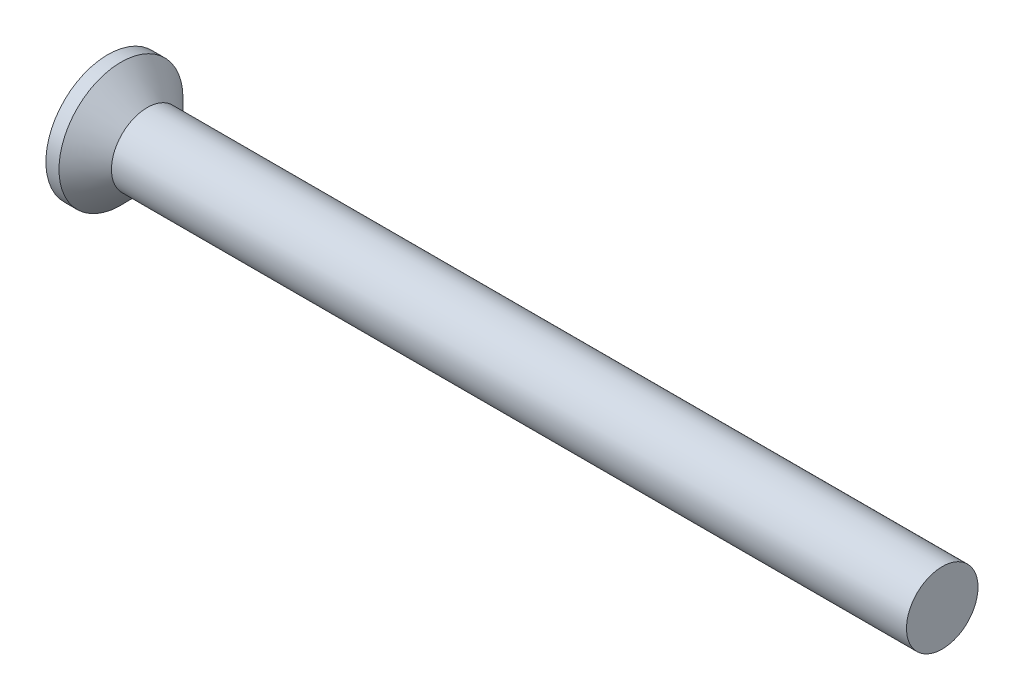
ISO-10303-21;
HEADER;
FILE_DESCRIPTION(('STEP AP214'),'2;1');
FILE_NAME('part.step','',(''),(''),'','','');
FILE_SCHEMA(('AUTOMOTIVE_DESIGN { 1 0 10303 214 1 1 1 1 }'));
ENDSEC;
DATA;
#1=APPLICATION_CONTEXT('core data for automotive mechanical design processes');
#2=APPLICATION_PROTOCOL_DEFINITION('international standard','automotive_design',2000,#1);
#3=PRODUCT_CONTEXT('',#1,'mechanical');
#4=PRODUCT('Part','Part','',(#3));
#5=PRODUCT_RELATED_PRODUCT_CATEGORY('part','',(#4));
#6=PRODUCT_DEFINITION_FORMATION('','',#4);
#7=PRODUCT_DEFINITION_CONTEXT('part definition',#1,'design');
#8=PRODUCT_DEFINITION('design','',#6,#7);
#9=PRODUCT_DEFINITION_SHAPE('','',#8);
#10=(LENGTH_UNIT() NAMED_UNIT(*) SI_UNIT(.MILLI.,.METRE.));
#11=(NAMED_UNIT(*) PLANE_ANGLE_UNIT() SI_UNIT($,.RADIAN.));
#12=(NAMED_UNIT(*) SI_UNIT($,.STERADIAN.) SOLID_ANGLE_UNIT());
#13=UNCERTAINTY_MEASURE_WITH_UNIT(LENGTH_MEASURE(1.E-05),#10,'distance_accuracy_value','');
#14=(GEOMETRIC_REPRESENTATION_CONTEXT(3) GLOBAL_UNCERTAINTY_ASSIGNED_CONTEXT((#13)) GLOBAL_UNIT_ASSIGNED_CONTEXT((#10,
#11,#12)) REPRESENTATION_CONTEXT('',''));
#15=CARTESIAN_POINT('',(0.,0.,0.));
#16=DIRECTION('',(0.,0.,1.));
#17=DIRECTION('',(1.,0.,0.));
#18=AXIS2_PLACEMENT_3D('',#15,#16,#17);
#19=CARTESIAN_POINT('',(0.,2.6,0.));
#20=DIRECTION('',(-1.,0.,0.));
#21=DIRECTION('',(0.,0.,1.));
#22=AXIS2_PLACEMENT_3D('',#19,#20,#21);
#23=PLANE('',#22);
#24=CARTESIAN_POINT('',(0.,0.,0.));
#25=DIRECTION('',(1.,0.,0.));
#26=DIRECTION('',(0.,0.,-1.));
#27=AXIS2_PLACEMENT_3D('',#24,#25,#26);
#28=CIRCLE('',#27,2.6);
#29=CARTESIAN_POINT('',(0.,0.,-2.6));
#30=VERTEX_POINT('',#29);
#31=EDGE_CURVE('E190',#30,#30,#28,.T.);
#32=ORIENTED_EDGE('',*,*,#31,.F.);
#33=EDGE_LOOP('',(#32));
#34=FACE_BOUND('',#33,.T.);
#35=DIRECTION('',(0.,1.,0.));
#36=VECTOR('',#35,1.);
#37=CARTESIAN_POINT('',(0.,-0.32,-0.32));
#38=LINE('',#37,#36);
#39=CARTESIAN_POINT('',(0.,-1.6,-0.32));
#40=VERTEX_POINT('',#39);
#41=CARTESIAN_POINT('',(0.,-0.62,-0.32));
#42=VERTEX_POINT('',#41);
#43=EDGE_CURVE('E316',#40,#42,#38,.T.);
#44=ORIENTED_EDGE('',*,*,#43,.T.);
#45=CARTESIAN_POINT('',(0.,-0.62,-0.62));
#46=DIRECTION('',(-1.,0.,0.));
#47=DIRECTION('',(0.,0.,1.));
#48=AXIS2_PLACEMENT_3D('',#45,#46,#47);
#49=CIRCLE('',#48,0.3);
#50=CARTESIAN_POINT('',(0.,-0.32,-0.62));
#51=VERTEX_POINT('',#50);
#52=EDGE_CURVE('E195',#42,#51,#49,.T.);
#53=ORIENTED_EDGE('',*,*,#52,.T.);
#54=DIRECTION('',(0.,0.,-1.));
#55=VECTOR('',#54,1.);
#56=CARTESIAN_POINT('',(0.,-0.32,-0.32));
#57=LINE('',#56,#55);
#58=CARTESIAN_POINT('',(0.,-0.32,-1.6));
#59=VERTEX_POINT('',#58);
#60=EDGE_CURVE('E318',#51,#59,#57,.T.);
#61=ORIENTED_EDGE('',*,*,#60,.T.);
#62=DIRECTION('',(0.,1.,0.));
#63=VECTOR('',#62,1.);
#64=CARTESIAN_POINT('',(0.,0.32,-1.6));
#65=LINE('',#64,#63);
#66=CARTESIAN_POINT('',(0.,0.32,-1.6));
#67=VERTEX_POINT('',#66);
#68=EDGE_CURVE('E320',#59,#67,#65,.T.);
#69=ORIENTED_EDGE('',*,*,#68,.T.);
#70=DIRECTION('',(0.,0.,1.));
#71=VECTOR('',#70,1.);
#72=CARTESIAN_POINT('',(0.,0.32,-0.32));
#73=LINE('',#72,#71);
#74=CARTESIAN_POINT('',(0.,0.32,-0.62));
#75=VERTEX_POINT('',#74);
#76=EDGE_CURVE('E323',#67,#75,#73,.T.);
#77=ORIENTED_EDGE('',*,*,#76,.T.);
#78=CARTESIAN_POINT('',(0.,0.62,-0.62));
#79=DIRECTION('',(-1.,0.,0.));
#80=DIRECTION('',(0.,0.,1.));
#81=AXIS2_PLACEMENT_3D('',#78,#79,#80);
#82=CIRCLE('',#81,0.3);
#83=CARTESIAN_POINT('',(0.,0.62,-0.32));
#84=VERTEX_POINT('',#83);
#85=EDGE_CURVE('E193',#75,#84,#82,.T.);
#86=ORIENTED_EDGE('',*,*,#85,.T.);
#87=DIRECTION('',(0.,1.,0.));
#88=VECTOR('',#87,1.);
#89=CARTESIAN_POINT('',(0.,0.32,-0.32));
#90=LINE('',#89,#88);
#91=CARTESIAN_POINT('',(0.,1.6,-0.32));
#92=VERTEX_POINT('',#91);
#93=EDGE_CURVE('E326',#84,#92,#90,.T.);
#94=ORIENTED_EDGE('',*,*,#93,.T.);
#95=DIRECTION('',(0.,0.,1.));
#96=VECTOR('',#95,1.);
#97=CARTESIAN_POINT('',(0.,1.6,-0.32));
#98=LINE('',#97,#96);
#99=CARTESIAN_POINT('',(0.,1.6,0.32));
#100=VERTEX_POINT('',#99);
#101=EDGE_CURVE('E328',#92,#100,#98,.T.);
#102=ORIENTED_EDGE('',*,*,#101,.T.);
#103=DIRECTION('',(0.,-1.,0.));
#104=VECTOR('',#103,1.);
#105=CARTESIAN_POINT('',(0.,0.32,0.32));
#106=LINE('',#105,#104);
#107=CARTESIAN_POINT('',(0.,0.62,0.32));
#108=VERTEX_POINT('',#107);
#109=EDGE_CURVE('E331',#100,#108,#106,.T.);
#110=ORIENTED_EDGE('',*,*,#109,.T.);
#111=CARTESIAN_POINT('',(0.,0.62,0.62));
#112=DIRECTION('',(-1.,0.,0.));
#113=DIRECTION('',(0.,0.,1.));
#114=AXIS2_PLACEMENT_3D('',#111,#112,#113);
#115=CIRCLE('',#114,0.3);
#116=CARTESIAN_POINT('',(0.,0.32,0.62));
#117=VERTEX_POINT('',#116);
#118=EDGE_CURVE('E158',#108,#117,#115,.T.);
#119=ORIENTED_EDGE('',*,*,#118,.T.);
#120=DIRECTION('',(0.,0.,1.));
#121=VECTOR('',#120,1.);
#122=CARTESIAN_POINT('',(0.,0.32,0.32));
#123=LINE('',#122,#121);
#124=CARTESIAN_POINT('',(0.,0.32,1.6));
#125=VERTEX_POINT('',#124);
#126=EDGE_CURVE('E152',#117,#125,#123,.T.);
#127=ORIENTED_EDGE('',*,*,#126,.T.);
#128=DIRECTION('',(0.,-1.,0.));
#129=VECTOR('',#128,1.);
#130=CARTESIAN_POINT('',(0.,0.32,1.6));
#131=LINE('',#130,#129);
#132=CARTESIAN_POINT('',(0.,-0.32,1.6));
#133=VERTEX_POINT('',#132);
#134=EDGE_CURVE('E156',#125,#133,#131,.T.);
#135=ORIENTED_EDGE('',*,*,#134,.T.);
#136=DIRECTION('',(0.,0.,-1.));
#137=VECTOR('',#136,1.);
#138=CARTESIAN_POINT('',(0.,-0.32,0.32));
#139=LINE('',#138,#137);
#140=CARTESIAN_POINT('',(0.,-0.32,0.62));
#141=VERTEX_POINT('',#140);
#142=EDGE_CURVE('E170',#133,#141,#139,.T.);
#143=ORIENTED_EDGE('',*,*,#142,.T.);
#144=CARTESIAN_POINT('',(0.,-0.62,0.62));
#145=DIRECTION('',(-1.,0.,0.));
#146=DIRECTION('',(0.,0.,1.));
#147=AXIS2_PLACEMENT_3D('',#144,#145,#146);
#148=CIRCLE('',#147,0.3);
#149=CARTESIAN_POINT('',(0.,-0.62,0.32));
#150=VERTEX_POINT('',#149);
#151=EDGE_CURVE('E189',#141,#150,#148,.T.);
#152=ORIENTED_EDGE('',*,*,#151,.T.);
#153=DIRECTION('',(0.,-1.,0.));
#154=VECTOR('',#153,1.);
#155=CARTESIAN_POINT('',(0.,-0.32,0.32));
#156=LINE('',#155,#154);
#157=CARTESIAN_POINT('',(0.,-1.6,0.319999999999999));
#158=VERTEX_POINT('',#157);
#159=EDGE_CURVE('E311',#150,#158,#156,.T.);
#160=ORIENTED_EDGE('',*,*,#159,.T.);
#161=DIRECTION('',(0.,0.,-1.));
#162=VECTOR('',#161,1.);
#163=CARTESIAN_POINT('',(0.,-1.6,-0.32));
#164=LINE('',#163,#162);
#165=EDGE_CURVE('E313',#158,#40,#164,.T.);
#166=ORIENTED_EDGE('',*,*,#165,.T.);
#167=EDGE_LOOP('',(#44,#53,#61,#69,#77,#86,#94,#102,#110,#119,#127,#135,#143,#152,#160,#166));
#168=FACE_BOUND('',#167,.T.);
#169=ADVANCED_FACE('F39',(#34,#168),#23,.T.);
#170=CARTESIAN_POINT('',(35.,1.5,0.));
#171=DIRECTION('',(1.,0.,0.));
#172=DIRECTION('',(0.,0.,-1.));
#173=AXIS2_PLACEMENT_3D('',#170,#171,#172);
#174=PLANE('',#173);
#175=CARTESIAN_POINT('',(35.,0.,0.));
#176=DIRECTION('',(1.,0.,0.));
#177=DIRECTION('',(0.,0.,-1.));
#178=AXIS2_PLACEMENT_3D('',#175,#176,#177);
#179=CIRCLE('',#178,1.5);
#180=CARTESIAN_POINT('',(35.,0.,-1.5));
#181=VERTEX_POINT('',#180);
#182=EDGE_CURVE('E176',#181,#181,#179,.T.);
#183=ORIENTED_EDGE('',*,*,#182,.T.);
#184=EDGE_LOOP('',(#183));
#185=FACE_BOUND('',#184,.T.);
#186=ADVANCED_FACE('F243',(#185),#174,.T.);
#187=CARTESIAN_POINT('',(4.51581291088132,0.,0.));
#188=DIRECTION('',(1.,0.,0.));
#189=DIRECTION('',(0.,0.,-1.));
#190=AXIS2_PLACEMENT_3D('',#187,#188,#189);
#191=CYLINDRICAL_SURFACE('',#190,2.6);
#192=ORIENTED_EDGE('',*,*,#31,.T.);
#193=EDGE_LOOP('',(#192));
#194=FACE_BOUND('',#193,.T.);
#195=CARTESIAN_POINT('',(0.550000000000004,0.,0.));
#196=DIRECTION('',(1.,0.,0.));
#197=DIRECTION('',(0.,0.,-1.));
#198=AXIS2_PLACEMENT_3D('',#195,#196,#197);
#199=CIRCLE('',#198,2.6);
#200=CARTESIAN_POINT('',(0.550000000000004,0.,-2.6));
#201=VERTEX_POINT('',#200);
#202=EDGE_CURVE('E335',#201,#201,#199,.T.);
#203=ORIENTED_EDGE('',*,*,#202,.F.);
#204=EDGE_LOOP('',(#203));
#205=FACE_BOUND('',#204,.T.);
#206=ADVANCED_FACE('F249',(#194,#205),#191,.T.);
#207=CARTESIAN_POINT('',(1.65,0.,0.));
#208=DIRECTION('',(-1.,0.,0.));
#209=DIRECTION('',(0.,0.,1.));
#210=AXIS2_PLACEMENT_3D('',#207,#208,#209);
#211=CONICAL_SURFACE('',#210,1.5,0.78539816339745);
#212=ORIENTED_EDGE('',*,*,#202,.T.);
#213=EDGE_LOOP('',(#212));
#214=FACE_BOUND('',#213,.T.);
#215=CARTESIAN_POINT('',(1.65,0.,0.));
#216=DIRECTION('',(1.,0.,0.));
#217=DIRECTION('',(0.,0.,-1.));
#218=AXIS2_PLACEMENT_3D('',#215,#216,#217);
#219=CIRCLE('',#218,1.5);
#220=CARTESIAN_POINT('',(1.65,0.,-1.5));
#221=VERTEX_POINT('',#220);
#222=EDGE_CURVE('E179',#221,#221,#219,.T.);
#223=ORIENTED_EDGE('',*,*,#222,.F.);
#224=EDGE_LOOP('',(#223));
#225=FACE_BOUND('',#224,.T.);
#226=ADVANCED_FACE('F371',(#214,#225),#211,.T.);
#227=CARTESIAN_POINT('',(4.51581291088132,0.,0.));
#228=DIRECTION('',(1.,0.,0.));
#229=DIRECTION('',(0.,0.,-1.));
#230=AXIS2_PLACEMENT_3D('',#227,#228,#229);
#231=CYLINDRICAL_SURFACE('',#230,1.5);
#232=ORIENTED_EDGE('',*,*,#222,.T.);
#233=EDGE_LOOP('',(#232));
#234=FACE_BOUND('',#233,.T.);
#235=ORIENTED_EDGE('',*,*,#182,.F.);
#236=EDGE_LOOP('',(#235));
#237=FACE_BOUND('',#236,.T.);
#238=ADVANCED_FACE('F369',(#234,#237),#231,.T.);
#239=CARTESIAN_POINT('',(0.825,0.32,0.32));
#240=DIRECTION('',(0.,-1.,0.));
#241=DIRECTION('',(0.,0.,-1.));
#242=AXIS2_PLACEMENT_3D('',#239,#240,#241);
#243=PLANE('',#242);
#244=ORIENTED_EDGE('',*,*,#126,.F.);
#245=DIRECTION('',(-1.,0.,0.));
#246=VECTOR('',#245,1.);
#247=CARTESIAN_POINT('',(0.825,0.32,0.62));
#248=LINE('',#247,#246);
#249=CARTESIAN_POINT('',(0.825,0.32,0.62));
#250=VERTEX_POINT('',#249);
#251=EDGE_CURVE('E207',#117,#250,#248,.F.);
#252=ORIENTED_EDGE('',*,*,#251,.T.);
#253=DIRECTION('',(0.,0.,1.));
#254=VECTOR('',#253,1.);
#255=CARTESIAN_POINT('',(0.825,0.32,0.32));
#256=LINE('',#255,#254);
#257=CARTESIAN_POINT('',(0.825,0.32,1.12368602791856));
#258=VERTEX_POINT('',#257);
#259=EDGE_CURVE('E174',#250,#258,#256,.T.);
#260=ORIENTED_EDGE('',*,*,#259,.T.);
#261=DIRECTION('',(-0.866025403784438,0.,0.500000000000001));
#262=VECTOR('',#261,1.);
#263=CARTESIAN_POINT('',(0.,0.32,1.6));
#264=LINE('',#263,#262);
#265=EDGE_CURVE('E166',#258,#125,#264,.T.);
#266=ORIENTED_EDGE('',*,*,#265,.T.);
#267=EDGE_LOOP('',(#244,#252,#260,#266));
#268=FACE_BOUND('',#267,.T.);
#269=ADVANCED_FACE('F172',(#268),#243,.T.);
#270=CARTESIAN_POINT('',(0.,0.32,1.6));
#271=DIRECTION('',(-0.500000000000001,0.,-0.866025403784438));
#272=DIRECTION('',(-0.866025403784438,0.,0.500000000000001));
#273=AXIS2_PLACEMENT_3D('',#270,#271,#272);
#274=PLANE('',#273);
#275=ORIENTED_EDGE('',*,*,#134,.F.);
#276=ORIENTED_EDGE('',*,*,#265,.F.);
#277=DIRECTION('',(0.,-1.,0.));
#278=VECTOR('',#277,1.);
#279=CARTESIAN_POINT('',(0.825,0.32,1.12368602791856));
#280=LINE('',#279,#278);
#281=CARTESIAN_POINT('',(0.825,-0.32,1.12368602791856));
#282=VERTEX_POINT('',#281);
#283=EDGE_CURVE('E185',#258,#282,#280,.T.);
#284=ORIENTED_EDGE('',*,*,#283,.T.);
#285=DIRECTION('',(-0.866025403784438,0.,0.500000000000001));
#286=VECTOR('',#285,1.);
#287=CARTESIAN_POINT('',(1.17300625842204,-0.32,0.922764520938917));
#288=LINE('',#287,#286);
#289=EDGE_CURVE('E168',#282,#133,#288,.T.);
#290=ORIENTED_EDGE('',*,*,#289,.T.);
#291=EDGE_LOOP('',(#275,#276,#284,#290));
#292=FACE_BOUND('',#291,.T.);
#293=ADVANCED_FACE('F165',(#292),#274,.T.);
#294=CARTESIAN_POINT('',(0.825,-0.32,0.32));
#295=DIRECTION('',(0.,1.,0.));
#296=DIRECTION('',(0.,0.,1.));
#297=AXIS2_PLACEMENT_3D('',#294,#295,#296);
#298=PLANE('',#297);
#299=DIRECTION('',(0.,0.,-1.));
#300=VECTOR('',#299,1.);
#301=CARTESIAN_POINT('',(0.825,-0.32,0.32));
#302=LINE('',#301,#300);
#303=CARTESIAN_POINT('',(0.825,-0.32,0.62));
#304=VERTEX_POINT('',#303);
#305=EDGE_CURVE('E357',#282,#304,#302,.T.);
#306=ORIENTED_EDGE('',*,*,#305,.T.);
#307=DIRECTION('',(-1.,0.,0.));
#308=VECTOR('',#307,1.);
#309=CARTESIAN_POINT('',(0.825,-0.32,0.62));
#310=LINE('',#309,#308);
#311=EDGE_CURVE('E209',#304,#141,#310,.T.);
#312=ORIENTED_EDGE('',*,*,#311,.T.);
#313=ORIENTED_EDGE('',*,*,#142,.F.);
#314=ORIENTED_EDGE('',*,*,#289,.F.);
#315=EDGE_LOOP('',(#306,#312,#313,#314));
#316=FACE_BOUND('',#315,.T.);
#317=ADVANCED_FACE('F263',(#316),#298,.T.);
#318=CARTESIAN_POINT('',(0.825,-0.32,0.32));
#319=DIRECTION('',(0.,0.,-1.));
#320=DIRECTION('',(0.,1.,0.));
#321=AXIS2_PLACEMENT_3D('',#318,#319,#320);
#322=PLANE('',#321);
#323=ORIENTED_EDGE('',*,*,#159,.F.);
#324=DIRECTION('',(-1.,0.,0.));
#325=VECTOR('',#324,1.);
#326=CARTESIAN_POINT('',(0.825,-0.62,0.32));
#327=LINE('',#326,#325);
#328=CARTESIAN_POINT('',(0.825,-0.62,0.32));
#329=VERTEX_POINT('',#328);
#330=EDGE_CURVE('E54',#150,#329,#327,.F.);
#331=ORIENTED_EDGE('',*,*,#330,.T.);
#332=DIRECTION('',(0.,-1.,0.));
#333=VECTOR('',#332,1.);
#334=CARTESIAN_POINT('',(0.825,-0.32,0.32));
#335=LINE('',#334,#333);
#336=CARTESIAN_POINT('',(0.825,-1.12368602791856,0.319999999999999));
#337=VERTEX_POINT('',#336);
#338=EDGE_CURVE('E300',#329,#337,#335,.T.);
#339=ORIENTED_EDGE('',*,*,#338,.T.);
#340=DIRECTION('',(-0.866025403784438,-0.500000000000001,0.));
#341=VECTOR('',#340,1.);
#342=CARTESIAN_POINT('',(0.,-1.6,0.319999999999999));
#343=LINE('',#342,#341);
#344=EDGE_CURVE('E181',#337,#158,#343,.T.);
#345=ORIENTED_EDGE('',*,*,#344,.T.);
#346=EDGE_LOOP('',(#323,#331,#339,#345));
#347=FACE_BOUND('',#346,.T.);
#348=ADVANCED_FACE('F268',(#347),#322,.T.);
#349=CARTESIAN_POINT('',(0.,-1.6,-0.32));
#350=DIRECTION('',(-0.500000000000001,0.866025403784438,0.));
#351=DIRECTION('',(-0.866025403784438,-0.500000000000001,0.));
#352=AXIS2_PLACEMENT_3D('',#349,#350,#351);
#353=PLANE('',#352);
#354=ORIENTED_EDGE('',*,*,#165,.F.);
#355=ORIENTED_EDGE('',*,*,#344,.F.);
#356=DIRECTION('',(0.,0.,-1.));
#357=VECTOR('',#356,1.);
#358=CARTESIAN_POINT('',(0.825,-1.12368602791856,-0.32));
#359=LINE('',#358,#357);
#360=CARTESIAN_POINT('',(0.825,-1.12368602791856,-0.32));
#361=VERTEX_POINT('',#360);
#362=EDGE_CURVE('E296',#337,#361,#359,.T.);
#363=ORIENTED_EDGE('',*,*,#362,.T.);
#364=DIRECTION('',(-0.866025403784438,-0.500000000000001,0.));
#365=VECTOR('',#364,1.);
#366=CARTESIAN_POINT('',(1.17300625842204,-0.922764520938917,-0.32));
#367=LINE('',#366,#365);
#368=EDGE_CURVE('E295',#361,#40,#367,.T.);
#369=ORIENTED_EDGE('',*,*,#368,.T.);
#370=EDGE_LOOP('',(#354,#355,#363,#369));
#371=FACE_BOUND('',#370,.T.);
#372=ADVANCED_FACE('F264',(#371),#353,.T.);
#373=CARTESIAN_POINT('',(0.825,-0.32,-0.32));
#374=DIRECTION('',(0.,0.,1.));
#375=DIRECTION('',(1.,0.,0.));
#376=AXIS2_PLACEMENT_3D('',#373,#374,#375);
#377=PLANE('',#376);
#378=DIRECTION('',(0.,1.,0.));
#379=VECTOR('',#378,1.);
#380=CARTESIAN_POINT('',(0.825,-0.32,-0.32));
#381=LINE('',#380,#379);
#382=CARTESIAN_POINT('',(0.825,-0.62,-0.32));
#383=VERTEX_POINT('',#382);
#384=EDGE_CURVE('E289',#361,#383,#381,.T.);
#385=ORIENTED_EDGE('',*,*,#384,.T.);
#386=DIRECTION('',(-1.,0.,0.));
#387=VECTOR('',#386,1.);
#388=CARTESIAN_POINT('',(0.825,-0.62,-0.32));
#389=LINE('',#388,#387);
#390=EDGE_CURVE('E186',#383,#42,#389,.T.);
#391=ORIENTED_EDGE('',*,*,#390,.T.);
#392=ORIENTED_EDGE('',*,*,#43,.F.);
#393=ORIENTED_EDGE('',*,*,#368,.F.);
#394=EDGE_LOOP('',(#385,#391,#392,#393));
#395=FACE_BOUND('',#394,.T.);
#396=ADVANCED_FACE('F267',(#395),#377,.T.);
#397=CARTESIAN_POINT('',(0.825,-0.32,-0.32));
#398=DIRECTION('',(0.,1.,0.));
#399=DIRECTION('',(0.,0.,1.));
#400=AXIS2_PLACEMENT_3D('',#397,#398,#399);
#401=PLANE('',#400);
#402=ORIENTED_EDGE('',*,*,#60,.F.);
#403=DIRECTION('',(-1.,0.,0.));
#404=VECTOR('',#403,1.);
#405=CARTESIAN_POINT('',(0.825,-0.32,-0.62));
#406=LINE('',#405,#404);
#407=CARTESIAN_POINT('',(0.825,-0.32,-0.62));
#408=VERTEX_POINT('',#407);
#409=EDGE_CURVE('E197',#51,#408,#406,.F.);
#410=ORIENTED_EDGE('',*,*,#409,.T.);
#411=DIRECTION('',(0.,0.,-1.));
#412=VECTOR('',#411,1.);
#413=CARTESIAN_POINT('',(0.825,-0.32,-0.32));
#414=LINE('',#413,#412);
#415=CARTESIAN_POINT('',(0.825,-0.32,-1.12368602791856));
#416=VERTEX_POINT('',#415);
#417=EDGE_CURVE('E291',#408,#416,#414,.T.);
#418=ORIENTED_EDGE('',*,*,#417,.T.);
#419=DIRECTION('',(-0.866025403784438,0.,-0.500000000000001));
#420=VECTOR('',#419,1.);
#421=CARTESIAN_POINT('',(0.,-0.32,-1.6));
#422=LINE('',#421,#420);
#423=EDGE_CURVE('E347',#416,#59,#422,.T.);
#424=ORIENTED_EDGE('',*,*,#423,.T.);
#425=EDGE_LOOP('',(#402,#410,#418,#424));
#426=FACE_BOUND('',#425,.T.);
#427=ADVANCED_FACE('F274',(#426),#401,.T.);
#428=CARTESIAN_POINT('',(0.,0.32,-1.6));
#429=DIRECTION('',(-0.500000000000001,0.,0.866025403784438));
#430=DIRECTION('',(0.866025403784438,0.,0.500000000000001));
#431=AXIS2_PLACEMENT_3D('',#428,#429,#430);
#432=PLANE('',#431);
#433=ORIENTED_EDGE('',*,*,#68,.F.);
#434=ORIENTED_EDGE('',*,*,#423,.F.);
#435=DIRECTION('',(0.,1.,0.));
#436=VECTOR('',#435,1.);
#437=CARTESIAN_POINT('',(0.825,0.32,-1.12368602791856));
#438=LINE('',#437,#436);
#439=CARTESIAN_POINT('',(0.825,0.32,-1.12368602791856));
#440=VERTEX_POINT('',#439);
#441=EDGE_CURVE('E298',#416,#440,#438,.T.);
#442=ORIENTED_EDGE('',*,*,#441,.T.);
#443=DIRECTION('',(-0.866025403784438,0.,-0.500000000000001));
#444=VECTOR('',#443,1.);
#445=CARTESIAN_POINT('',(1.17300625842204,0.32,-0.922764520938917));
#446=LINE('',#445,#444);
#447=EDGE_CURVE('E345',#440,#67,#446,.T.);
#448=ORIENTED_EDGE('',*,*,#447,.T.);
#449=EDGE_LOOP('',(#433,#434,#442,#448));
#450=FACE_BOUND('',#449,.T.);
#451=ADVANCED_FACE('F270',(#450),#432,.T.);
#452=CARTESIAN_POINT('',(0.825,0.32,-0.32));
#453=DIRECTION('',(0.,-1.,0.));
#454=DIRECTION('',(0.,0.,-1.));
#455=AXIS2_PLACEMENT_3D('',#452,#453,#454);
#456=PLANE('',#455);
#457=DIRECTION('',(0.,0.,1.));
#458=VECTOR('',#457,1.);
#459=CARTESIAN_POINT('',(0.825,0.32,-0.32));
#460=LINE('',#459,#458);
#461=CARTESIAN_POINT('',(0.825,0.32,-0.62));
#462=VERTEX_POINT('',#461);
#463=EDGE_CURVE('E305',#440,#462,#460,.T.);
#464=ORIENTED_EDGE('',*,*,#463,.T.);
#465=DIRECTION('',(-1.,0.,0.));
#466=VECTOR('',#465,1.);
#467=CARTESIAN_POINT('',(0.825,0.32,-0.62));
#468=LINE('',#467,#466);
#469=EDGE_CURVE('E199',#462,#75,#468,.T.);
#470=ORIENTED_EDGE('',*,*,#469,.T.);
#471=ORIENTED_EDGE('',*,*,#76,.F.);
#472=ORIENTED_EDGE('',*,*,#447,.F.);
#473=EDGE_LOOP('',(#464,#470,#471,#472));
#474=FACE_BOUND('',#473,.T.);
#475=ADVANCED_FACE('F273',(#474),#456,.T.);
#476=CARTESIAN_POINT('',(0.825,0.32,-0.32));
#477=DIRECTION('',(0.,0.,1.));
#478=DIRECTION('',(1.,0.,0.));
#479=AXIS2_PLACEMENT_3D('',#476,#477,#478);
#480=PLANE('',#479);
#481=ORIENTED_EDGE('',*,*,#93,.F.);
#482=DIRECTION('',(-1.,0.,0.));
#483=VECTOR('',#482,1.);
#484=CARTESIAN_POINT('',(0.825,0.62,-0.32));
#485=LINE('',#484,#483);
#486=CARTESIAN_POINT('',(0.825,0.62,-0.32));
#487=VERTEX_POINT('',#486);
#488=EDGE_CURVE('E202',#84,#487,#485,.F.);
#489=ORIENTED_EDGE('',*,*,#488,.T.);
#490=DIRECTION('',(0.,1.,0.));
#491=VECTOR('',#490,1.);
#492=CARTESIAN_POINT('',(0.825,0.32,-0.32));
#493=LINE('',#492,#491);
#494=CARTESIAN_POINT('',(0.825,1.12368602791856,-0.32));
#495=VERTEX_POINT('',#494);
#496=EDGE_CURVE('E308',#487,#495,#493,.T.);
#497=ORIENTED_EDGE('',*,*,#496,.T.);
#498=DIRECTION('',(-0.866025403784438,0.500000000000001,0.));
#499=VECTOR('',#498,1.);
#500=CARTESIAN_POINT('',(0.,1.6,-0.32));
#501=LINE('',#500,#499);
#502=EDGE_CURVE('E341',#495,#92,#501,.T.);
#503=ORIENTED_EDGE('',*,*,#502,.T.);
#504=EDGE_LOOP('',(#481,#489,#497,#503));
#505=FACE_BOUND('',#504,.T.);
#506=ADVANCED_FACE('F259',(#505),#480,.T.);
#507=CARTESIAN_POINT('',(0.,1.6,-0.32));
#508=DIRECTION('',(-0.500000000000001,-0.866025403784438,0.));
#509=DIRECTION('',(0.866025403784438,-0.500000000000001,0.));
#510=AXIS2_PLACEMENT_3D('',#507,#508,#509);
#511=PLANE('',#510);
#512=ORIENTED_EDGE('',*,*,#101,.F.);
#513=ORIENTED_EDGE('',*,*,#502,.F.);
#514=DIRECTION('',(0.,0.,1.));
#515=VECTOR('',#514,1.);
#516=CARTESIAN_POINT('',(0.825,1.12368602791856,-0.32));
#517=LINE('',#516,#515);
#518=CARTESIAN_POINT('',(0.825,1.12368602791856,0.32));
#519=VERTEX_POINT('',#518);
#520=EDGE_CURVE('E229',#495,#519,#517,.T.);
#521=ORIENTED_EDGE('',*,*,#520,.T.);
#522=DIRECTION('',(-0.866025403784438,0.500000000000001,0.));
#523=VECTOR('',#522,1.);
#524=CARTESIAN_POINT('',(1.17300625842204,0.922764520938917,0.32));
#525=LINE('',#524,#523);
#526=EDGE_CURVE('E228',#519,#100,#525,.T.);
#527=ORIENTED_EDGE('',*,*,#526,.T.);
#528=EDGE_LOOP('',(#512,#513,#521,#527));
#529=FACE_BOUND('',#528,.T.);
#530=ADVANCED_FACE('F256',(#529),#511,.T.);
#531=CARTESIAN_POINT('',(0.825,0.32,0.32));
#532=DIRECTION('',(0.,0.,-1.));
#533=DIRECTION('',(0.,1.,0.));
#534=AXIS2_PLACEMENT_3D('',#531,#532,#533);
#535=PLANE('',#534);
#536=DIRECTION('',(0.,-1.,0.));
#537=VECTOR('',#536,1.);
#538=CARTESIAN_POINT('',(0.825,0.32,0.32));
#539=LINE('',#538,#537);
#540=CARTESIAN_POINT('',(0.825,0.62,0.32));
#541=VERTEX_POINT('',#540);
#542=EDGE_CURVE('E221',#519,#541,#539,.T.);
#543=ORIENTED_EDGE('',*,*,#542,.T.);
#544=DIRECTION('',(-1.,0.,0.));
#545=VECTOR('',#544,1.);
#546=CARTESIAN_POINT('',(0.825,0.62,0.32));
#547=LINE('',#546,#545);
#548=EDGE_CURVE('E204',#541,#108,#547,.T.);
#549=ORIENTED_EDGE('',*,*,#548,.T.);
#550=ORIENTED_EDGE('',*,*,#109,.F.);
#551=ORIENTED_EDGE('',*,*,#526,.F.);
#552=EDGE_LOOP('',(#543,#549,#550,#551));
#553=FACE_BOUND('',#552,.T.);
#554=ADVANCED_FACE('F226',(#553),#535,.T.);
#555=CARTESIAN_POINT('',(0.825,0.32,0.32));
#556=DIRECTION('',(1.,0.,0.));
#557=DIRECTION('',(0.,0.,-1.));
#558=AXIS2_PLACEMENT_3D('',#555,#556,#557);
#559=PLANE('',#558);
#560=ORIENTED_EDGE('',*,*,#259,.F.);
#561=CARTESIAN_POINT('',(0.825,0.62,0.62));
#562=DIRECTION('',(1.,0.,0.));
#563=DIRECTION('',(0.,0.,-1.));
#564=AXIS2_PLACEMENT_3D('',#561,#562,#563);
#565=CIRCLE('',#564,0.3);
#566=EDGE_CURVE('E47',#250,#541,#565,.T.);
#567=ORIENTED_EDGE('',*,*,#566,.T.);
#568=ORIENTED_EDGE('',*,*,#542,.F.);
#569=ORIENTED_EDGE('',*,*,#520,.F.);
#570=ORIENTED_EDGE('',*,*,#496,.F.);
#571=CARTESIAN_POINT('',(0.825,0.62,-0.62));
#572=DIRECTION('',(1.,0.,0.));
#573=DIRECTION('',(0.,0.,-1.));
#574=AXIS2_PLACEMENT_3D('',#571,#572,#573);
#575=CIRCLE('',#574,0.3);
#576=EDGE_CURVE('E215',#487,#462,#575,.T.);
#577=ORIENTED_EDGE('',*,*,#576,.T.);
#578=ORIENTED_EDGE('',*,*,#463,.F.);
#579=ORIENTED_EDGE('',*,*,#441,.F.);
#580=ORIENTED_EDGE('',*,*,#417,.F.);
#581=CARTESIAN_POINT('',(0.825,-0.62,-0.62));
#582=DIRECTION('',(1.,0.,0.));
#583=DIRECTION('',(0.,0.,-1.));
#584=AXIS2_PLACEMENT_3D('',#581,#582,#583);
#585=CIRCLE('',#584,0.3);
#586=EDGE_CURVE('E213',#408,#383,#585,.T.);
#587=ORIENTED_EDGE('',*,*,#586,.T.);
#588=ORIENTED_EDGE('',*,*,#384,.F.);
#589=ORIENTED_EDGE('',*,*,#362,.F.);
#590=ORIENTED_EDGE('',*,*,#338,.F.);
#591=CARTESIAN_POINT('',(0.825,-0.62,0.62));
#592=DIRECTION('',(1.,0.,0.));
#593=DIRECTION('',(0.,0.,-1.));
#594=AXIS2_PLACEMENT_3D('',#591,#592,#593);
#595=CIRCLE('',#594,0.3);
#596=EDGE_CURVE('E11',#329,#304,#595,.T.);
#597=ORIENTED_EDGE('',*,*,#596,.T.);
#598=ORIENTED_EDGE('',*,*,#305,.F.);
#599=ORIENTED_EDGE('',*,*,#283,.F.);
#600=EDGE_LOOP('',(#560,#567,#568,#569,#570,#577,#578,#579,#580,#587,#588,#589,#590,#597,#598,#599));
#601=FACE_BOUND('',#600,.T.);
#602=ADVANCED_FACE('F219',(#601),#559,.F.);
#603=CARTESIAN_POINT('',(0.825,-0.62,-0.62));
#604=DIRECTION('',(-1.,0.,0.));
#605=DIRECTION('',(0.,0.,1.));
#606=AXIS2_PLACEMENT_3D('',#603,#604,#605);
#607=CYLINDRICAL_SURFACE('',#606,0.3);
#608=ORIENTED_EDGE('',*,*,#586,.F.);
#609=ORIENTED_EDGE('',*,*,#409,.F.);
#610=ORIENTED_EDGE('',*,*,#52,.F.);
#611=ORIENTED_EDGE('',*,*,#390,.F.);
#612=EDGE_LOOP('',(#608,#609,#610,#611));
#613=FACE_BOUND('',#612,.T.);
#614=ADVANCED_FACE('F239',(#613),#607,.T.);
#615=CARTESIAN_POINT('',(0.825,0.62,-0.62));
#616=DIRECTION('',(-1.,0.,0.));
#617=DIRECTION('',(0.,0.,1.));
#618=AXIS2_PLACEMENT_3D('',#615,#616,#617);
#619=CYLINDRICAL_SURFACE('',#618,0.3);
#620=ORIENTED_EDGE('',*,*,#576,.F.);
#621=ORIENTED_EDGE('',*,*,#488,.F.);
#622=ORIENTED_EDGE('',*,*,#85,.F.);
#623=ORIENTED_EDGE('',*,*,#469,.F.);
#624=EDGE_LOOP('',(#620,#621,#622,#623));
#625=FACE_BOUND('',#624,.T.);
#626=ADVANCED_FACE('F233',(#625),#619,.T.);
#627=CARTESIAN_POINT('',(0.825,0.62,0.62));
#628=DIRECTION('',(-1.,0.,0.));
#629=DIRECTION('',(0.,0.,1.));
#630=AXIS2_PLACEMENT_3D('',#627,#628,#629);
#631=CYLINDRICAL_SURFACE('',#630,0.3);
#632=ORIENTED_EDGE('',*,*,#566,.F.);
#633=ORIENTED_EDGE('',*,*,#251,.F.);
#634=ORIENTED_EDGE('',*,*,#118,.F.);
#635=ORIENTED_EDGE('',*,*,#548,.F.);
#636=EDGE_LOOP('',(#632,#633,#634,#635));
#637=FACE_BOUND('',#636,.T.);
#638=ADVANCED_FACE('F231',(#637),#631,.T.);
#639=CARTESIAN_POINT('',(0.825,-0.62,0.62));
#640=DIRECTION('',(-1.,0.,0.));
#641=DIRECTION('',(0.,0.,1.));
#642=AXIS2_PLACEMENT_3D('',#639,#640,#641);
#643=CYLINDRICAL_SURFACE('',#642,0.3);
#644=ORIENTED_EDGE('',*,*,#596,.F.);
#645=ORIENTED_EDGE('',*,*,#330,.F.);
#646=ORIENTED_EDGE('',*,*,#151,.F.);
#647=ORIENTED_EDGE('',*,*,#311,.F.);
#648=EDGE_LOOP('',(#644,#645,#646,#647));
#649=FACE_BOUND('',#648,.T.);
#650=ADVANCED_FACE('F41',(#649),#643,.T.);
#651=CLOSED_SHELL('',(#169,#186,#206,#226,#238,#269,#293,#317,#348,#372,#396,#427,#451,#475,
#506,#530,#554,#602,#614,#626,#638,#650));
#652=MANIFOLD_SOLID_BREP('B2',#651);
#653=ADVANCED_BREP_SHAPE_REPRESENTATION('',(#18,#652),#14);
#654=SHAPE_DEFINITION_REPRESENTATION(#9,#653);
ENDSEC;
END-ISO-10303-21;
